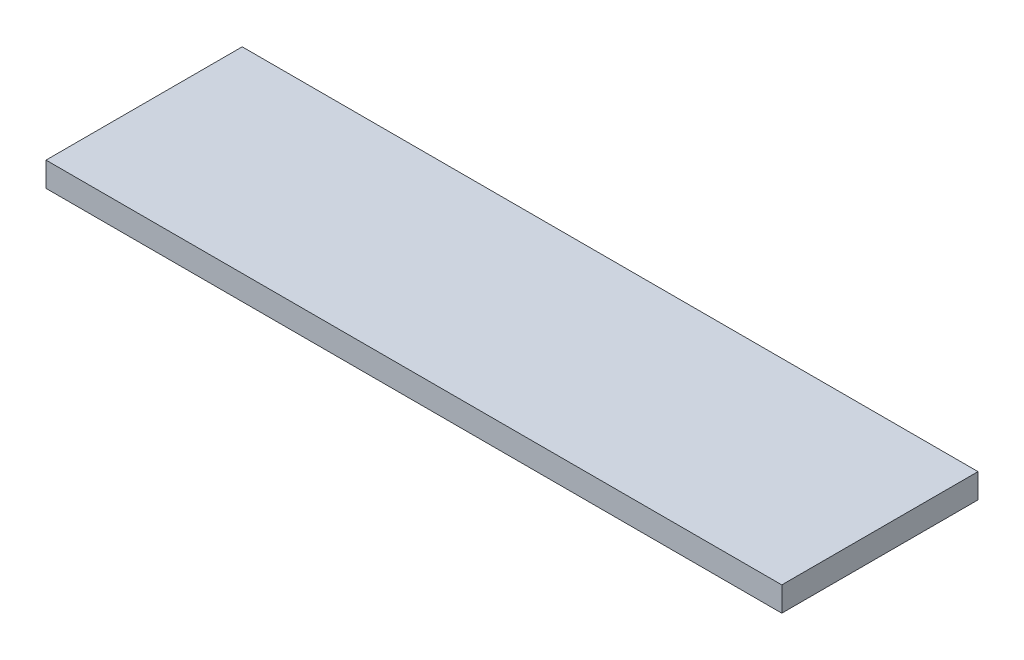
ISO-10303-21;
HEADER;
FILE_DESCRIPTION(('STEP AP214'),'2;1');
FILE_NAME('part.step','',(''),(''),'','','');
FILE_SCHEMA(('AUTOMOTIVE_DESIGN { 1 0 10303 214 1 1 1 1 }'));
ENDSEC;
DATA;
#1=APPLICATION_CONTEXT('core data for automotive mechanical design processes');
#2=APPLICATION_PROTOCOL_DEFINITION('international standard','automotive_design',2000,#1);
#3=PRODUCT_CONTEXT('',#1,'mechanical');
#4=PRODUCT('Part','Part','',(#3));
#5=PRODUCT_RELATED_PRODUCT_CATEGORY('part','',(#4));
#6=PRODUCT_DEFINITION_FORMATION('','',#4);
#7=PRODUCT_DEFINITION_CONTEXT('part definition',#1,'design');
#8=PRODUCT_DEFINITION('design','',#6,#7);
#9=PRODUCT_DEFINITION_SHAPE('','',#8);
#10=(LENGTH_UNIT() NAMED_UNIT(*) SI_UNIT(.MILLI.,.METRE.));
#11=(NAMED_UNIT(*) PLANE_ANGLE_UNIT() SI_UNIT($,.RADIAN.));
#12=(NAMED_UNIT(*) SI_UNIT($,.STERADIAN.) SOLID_ANGLE_UNIT());
#13=UNCERTAINTY_MEASURE_WITH_UNIT(LENGTH_MEASURE(1.E-05),#10,'distance_accuracy_value','');
#14=(GEOMETRIC_REPRESENTATION_CONTEXT(3) GLOBAL_UNCERTAINTY_ASSIGNED_CONTEXT((#13)) GLOBAL_UNIT_ASSIGNED_CONTEXT((#10,
#11,#12)) REPRESENTATION_CONTEXT('',''));
#15=CARTESIAN_POINT('',(0.,0.,0.));
#16=DIRECTION('',(0.,0.,1.));
#17=DIRECTION('',(1.,0.,0.));
#18=AXIS2_PLACEMENT_3D('',#15,#16,#17);
#19=CARTESIAN_POINT('',(15.,1.,-4.));
#20=DIRECTION('',(-1.,0.,0.));
#21=DIRECTION('',(0.,0.,1.));
#22=AXIS2_PLACEMENT_3D('',#19,#20,#21);
#23=PLANE('',#22);
#24=DIRECTION('',(0.,0.,-1.));
#25=VECTOR('',#24,1.);
#26=CARTESIAN_POINT('',(15.,0.,-4.));
#27=LINE('',#26,#25);
#28=CARTESIAN_POINT('',(15.,0.,4.));
#29=VERTEX_POINT('',#28);
#30=CARTESIAN_POINT('',(15.,0.,-4.));
#31=VERTEX_POINT('',#30);
#32=EDGE_CURVE('E107',#29,#31,#27,.T.);
#33=ORIENTED_EDGE('',*,*,#32,.T.);
#34=DIRECTION('',(0.,-1.,0.));
#35=VECTOR('',#34,1.);
#36=CARTESIAN_POINT('',(15.,1.,-4.));
#37=LINE('',#36,#35);
#38=CARTESIAN_POINT('',(15.,1.,-4.));
#39=VERTEX_POINT('',#38);
#40=EDGE_CURVE('E11',#39,#31,#37,.T.);
#41=ORIENTED_EDGE('',*,*,#40,.F.);
#42=DIRECTION('',(0.,0.,-1.));
#43=VECTOR('',#42,1.);
#44=CARTESIAN_POINT('',(15.,1.,-4.));
#45=LINE('',#44,#43);
#46=CARTESIAN_POINT('',(15.,1.,4.));
#47=VERTEX_POINT('',#46);
#48=EDGE_CURVE('E91',#47,#39,#45,.T.);
#49=ORIENTED_EDGE('',*,*,#48,.F.);
#50=DIRECTION('',(0.,-1.,0.));
#51=VECTOR('',#50,1.);
#52=CARTESIAN_POINT('',(15.,1.,4.));
#53=LINE('',#52,#51);
#54=EDGE_CURVE('E103',#47,#29,#53,.T.);
#55=ORIENTED_EDGE('',*,*,#54,.T.);
#56=EDGE_LOOP('',(#33,#41,#49,#55));
#57=FACE_BOUND('',#56,.T.);
#58=ADVANCED_FACE('F39',(#57),#23,.F.);
#59=CARTESIAN_POINT('',(-15.,1.,-4.));
#60=DIRECTION('',(0.,0.,1.));
#61=DIRECTION('',(1.,0.,0.));
#62=AXIS2_PLACEMENT_3D('',#59,#60,#61);
#63=PLANE('',#62);
#64=DIRECTION('',(-1.,0.,0.));
#65=VECTOR('',#64,1.);
#66=CARTESIAN_POINT('',(-15.,0.,-4.));
#67=LINE('',#66,#65);
#68=CARTESIAN_POINT('',(-15.,0.,-4.));
#69=VERTEX_POINT('',#68);
#70=EDGE_CURVE('E96',#31,#69,#67,.T.);
#71=ORIENTED_EDGE('',*,*,#70,.T.);
#72=DIRECTION('',(0.,-1.,0.));
#73=VECTOR('',#72,1.);
#74=CARTESIAN_POINT('',(-15.,1.,-4.));
#75=LINE('',#74,#73);
#76=CARTESIAN_POINT('',(-15.,1.,-4.));
#77=VERTEX_POINT('',#76);
#78=EDGE_CURVE('E48',#77,#69,#75,.T.);
#79=ORIENTED_EDGE('',*,*,#78,.F.);
#80=DIRECTION('',(-1.,0.,0.));
#81=VECTOR('',#80,1.);
#82=CARTESIAN_POINT('',(-15.,1.,-4.));
#83=LINE('',#82,#81);
#84=EDGE_CURVE('E86',#39,#77,#83,.T.);
#85=ORIENTED_EDGE('',*,*,#84,.F.);
#86=ORIENTED_EDGE('',*,*,#40,.T.);
#87=EDGE_LOOP('',(#71,#79,#85,#86));
#88=FACE_BOUND('',#87,.T.);
#89=ADVANCED_FACE('F95',(#88),#63,.F.);
#90=CARTESIAN_POINT('',(-15.,1.,-4.));
#91=DIRECTION('',(1.,0.,0.));
#92=DIRECTION('',(0.,0.,-1.));
#93=AXIS2_PLACEMENT_3D('',#90,#91,#92);
#94=PLANE('',#93);
#95=DIRECTION('',(0.,0.,1.));
#96=VECTOR('',#95,1.);
#97=CARTESIAN_POINT('',(-15.,0.,-4.));
#98=LINE('',#97,#96);
#99=CARTESIAN_POINT('',(-15.,0.,4.));
#100=VERTEX_POINT('',#99);
#101=EDGE_CURVE('E73',#69,#100,#98,.T.);
#102=ORIENTED_EDGE('',*,*,#101,.T.);
#103=DIRECTION('',(0.,-1.,0.));
#104=VECTOR('',#103,1.);
#105=CARTESIAN_POINT('',(-15.,1.,4.));
#106=LINE('',#105,#104);
#107=CARTESIAN_POINT('',(-15.,1.,4.));
#108=VERTEX_POINT('',#107);
#109=EDGE_CURVE('E98',#108,#100,#106,.T.);
#110=ORIENTED_EDGE('',*,*,#109,.F.);
#111=DIRECTION('',(0.,0.,1.));
#112=VECTOR('',#111,1.);
#113=CARTESIAN_POINT('',(-15.,1.,-4.));
#114=LINE('',#113,#112);
#115=EDGE_CURVE('E89',#77,#108,#114,.T.);
#116=ORIENTED_EDGE('',*,*,#115,.F.);
#117=ORIENTED_EDGE('',*,*,#78,.T.);
#118=EDGE_LOOP('',(#102,#110,#116,#117));
#119=FACE_BOUND('',#118,.T.);
#120=ADVANCED_FACE('F99',(#119),#94,.F.);
#121=CARTESIAN_POINT('',(-15.,1.,4.));
#122=DIRECTION('',(0.,0.,-1.));
#123=DIRECTION('',(-1.,0.,0.));
#124=AXIS2_PLACEMENT_3D('',#121,#122,#123);
#125=PLANE('',#124);
#126=DIRECTION('',(1.,0.,0.));
#127=VECTOR('',#126,1.);
#128=CARTESIAN_POINT('',(-15.,0.,4.));
#129=LINE('',#128,#127);
#130=EDGE_CURVE('E79',#100,#29,#129,.T.);
#131=ORIENTED_EDGE('',*,*,#130,.T.);
#132=ORIENTED_EDGE('',*,*,#54,.F.);
#133=DIRECTION('',(1.,0.,0.));
#134=VECTOR('',#133,1.);
#135=CARTESIAN_POINT('',(-15.,1.,4.));
#136=LINE('',#135,#134);
#137=EDGE_CURVE('E56',#108,#47,#136,.T.);
#138=ORIENTED_EDGE('',*,*,#137,.F.);
#139=ORIENTED_EDGE('',*,*,#109,.T.);
#140=EDGE_LOOP('',(#131,#132,#138,#139));
#141=FACE_BOUND('',#140,.T.);
#142=ADVANCED_FACE('F120',(#141),#125,.F.);
#143=CARTESIAN_POINT('',(0.,1.,0.));
#144=DIRECTION('',(0.,1.,0.));
#145=DIRECTION('',(0.,0.,1.));
#146=AXIS2_PLACEMENT_3D('',#143,#144,#145);
#147=PLANE('',#146);
#148=ORIENTED_EDGE('',*,*,#48,.T.);
#149=ORIENTED_EDGE('',*,*,#84,.T.);
#150=ORIENTED_EDGE('',*,*,#115,.T.);
#151=ORIENTED_EDGE('',*,*,#137,.T.);
#152=EDGE_LOOP('',(#148,#149,#150,#151));
#153=FACE_BOUND('',#152,.T.);
#154=ADVANCED_FACE('F87',(#153),#147,.T.);
#155=CARTESIAN_POINT('',(0.,0.,0.));
#156=DIRECTION('',(0.,1.,0.));
#157=DIRECTION('',(0.,0.,1.));
#158=AXIS2_PLACEMENT_3D('',#155,#156,#157);
#159=PLANE('',#158);
#160=ORIENTED_EDGE('',*,*,#32,.F.);
#161=ORIENTED_EDGE('',*,*,#130,.F.);
#162=ORIENTED_EDGE('',*,*,#101,.F.);
#163=ORIENTED_EDGE('',*,*,#70,.F.);
#164=EDGE_LOOP('',(#160,#161,#162,#163));
#165=FACE_BOUND('',#164,.T.);
#166=ADVANCED_FACE('F123',(#165),#159,.F.);
#167=CLOSED_SHELL('',(#58,#89,#120,#142,#154,#166));
#168=MANIFOLD_SOLID_BREP('B2',#167);
#169=ADVANCED_BREP_SHAPE_REPRESENTATION('',(#18,#168),#14);
#170=SHAPE_DEFINITION_REPRESENTATION(#9,#169);
ENDSEC;
END-ISO-10303-21;
